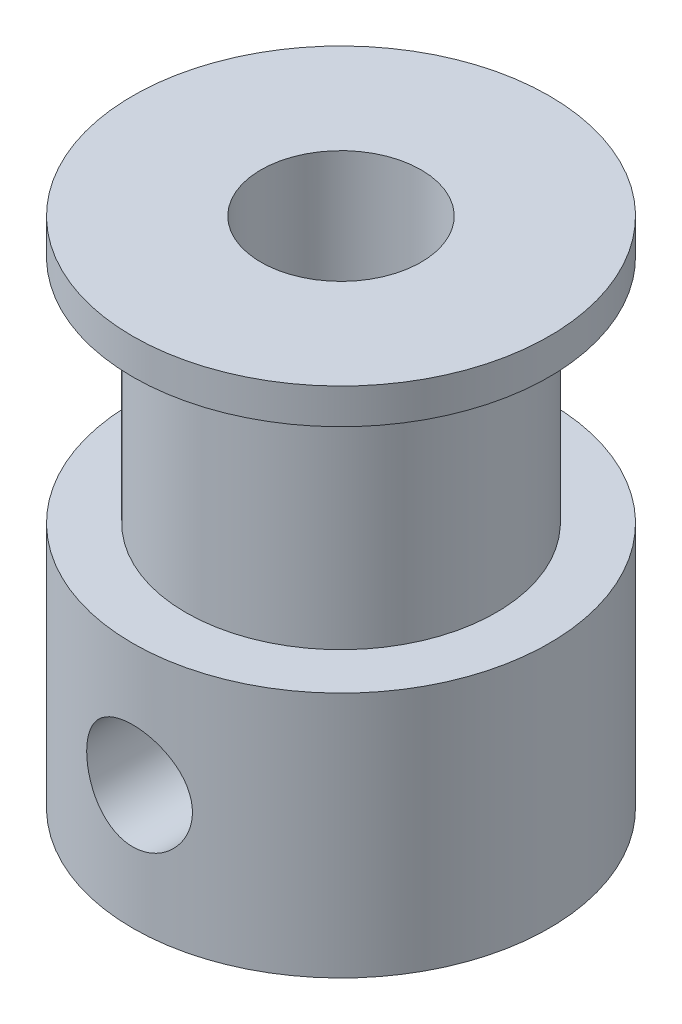
ISO-10303-21;
HEADER;
FILE_DESCRIPTION(('STEP AP214'),'2;1');
FILE_NAME('part.step','',(''),(''),'','','');
FILE_SCHEMA(('AUTOMOTIVE_DESIGN { 1 0 10303 214 1 1 1 1 }'));
ENDSEC;
DATA;
#1=APPLICATION_CONTEXT('core data for automotive mechanical design processes');
#2=APPLICATION_PROTOCOL_DEFINITION('international standard','automotive_design',2000,#1);
#3=PRODUCT_CONTEXT('',#1,'mechanical');
#4=PRODUCT('Part','Part','',(#3));
#5=PRODUCT_RELATED_PRODUCT_CATEGORY('part','',(#4));
#6=PRODUCT_DEFINITION_FORMATION('','',#4);
#7=PRODUCT_DEFINITION_CONTEXT('part definition',#1,'design');
#8=PRODUCT_DEFINITION('design','',#6,#7);
#9=PRODUCT_DEFINITION_SHAPE('','',#8);
#10=(LENGTH_UNIT() NAMED_UNIT(*) SI_UNIT(.MILLI.,.METRE.));
#11=(NAMED_UNIT(*) PLANE_ANGLE_UNIT() SI_UNIT($,.RADIAN.));
#12=(NAMED_UNIT(*) SI_UNIT($,.STERADIAN.) SOLID_ANGLE_UNIT());
#13=UNCERTAINTY_MEASURE_WITH_UNIT(LENGTH_MEASURE(1.E-05),#10,'distance_accuracy_value','');
#14=(GEOMETRIC_REPRESENTATION_CONTEXT(3) GLOBAL_UNCERTAINTY_ASSIGNED_CONTEXT((#13)) GLOBAL_UNIT_ASSIGNED_CONTEXT((#10,
#11,#12)) REPRESENTATION_CONTEXT('',''));
#15=CARTESIAN_POINT('',(0.,0.,0.));
#16=DIRECTION('',(0.,0.,1.));
#17=DIRECTION('',(1.,0.,0.));
#18=AXIS2_PLACEMENT_3D('',#15,#16,#17);
#19=CARTESIAN_POINT('',(0.,0.,0.));
#20=DIRECTION('',(0.,-1.,0.));
#21=DIRECTION('',(0.,0.,-1.));
#22=AXIS2_PLACEMENT_3D('',#19,#20,#21);
#23=CYLINDRICAL_SURFACE('',#22,2.5);
#24=CARTESIAN_POINT('',(-1.87816399709929,3.85,-1.65));
#25=CARTESIAN_POINT('',(-1.87817356740866,3.93079427655975,-1.64999443072167));
#26=CARTESIAN_POINT('',(-1.88347418282792,4.01162636905579,-1.64401449371116));
#27=CARTESIAN_POINT('',(-1.90365752241832,4.17041795060532,-1.62058860250623));
#28=CARTESIAN_POINT('',(-1.9185574504896,4.24837201591593,-1.6031220608348));
#29=CARTESIAN_POINT('',(-1.95530612756547,4.39863333158224,-1.55807727538571));
#30=CARTESIAN_POINT('',(-1.97708883218855,4.47098643150526,-1.53059477126485));
#31=CARTESIAN_POINT('',(-2.02503214275444,4.60994524738078,-1.46657517741326));
#32=CARTESIAN_POINT('',(-2.05119370638084,4.67654970122849,-1.43003610611277));
#33=CARTESIAN_POINT('',(-2.10971828562918,4.81321736687682,-1.342483593019));
#34=CARTESIAN_POINT('',(-2.14241946389367,4.88226727651007,-1.29011420470095));
#35=CARTESIAN_POINT('',(-2.20758221587981,5.01147714614391,-1.17514144468482));
#36=CARTESIAN_POINT('',(-2.24004353252862,5.07162860029669,-1.11252840012499));
#37=CARTESIAN_POINT('',(-2.3064419767716,5.18973271619889,-0.968234915676902));
#38=CARTESIAN_POINT('',(-2.33994640603816,5.24619090363769,-0.885111648041926));
#39=CARTESIAN_POINT('',(-2.39949293751456,5.34384115428656,-0.707908997031482));
#40=CARTESIAN_POINT('',(-2.42554320107045,5.38504992824282,-0.613841755901947));
#41=CARTESIAN_POINT('',(-2.46464353514927,5.44607361226672,-0.428365536633292));
#42=CARTESIAN_POINT('',(-2.47881191391302,5.46774914948944,-0.337811072451697));
#43=CARTESIAN_POINT('',(-2.49700266516608,5.49549014711655,-0.15338070492647));
#44=CARTESIAN_POINT('',(-2.50103745363967,5.50157471024375,-0.0595090091735782));
#45=CARTESIAN_POINT('',(-2.49868729659539,5.49800862462096,0.113712663637894));
#46=CARTESIAN_POINT('',(-2.49376656842583,5.49056933208685,0.193140500290931));
#47=CARTESIAN_POINT('',(-2.47671798966374,5.46453692457822,0.3493383081911));
#48=CARTESIAN_POINT('',(-2.46458960851095,5.44594298850181,0.426108083336214));
#49=CARTESIAN_POINT('',(-2.4341916732427,5.39858528412734,0.574862419576148));
#50=CARTESIAN_POINT('',(-2.41593946394568,5.36985022722839,0.646859815580449));
#51=CARTESIAN_POINT('',(-2.37464804586783,5.30331789592823,0.785017034503283));
#52=CARTESIAN_POINT('',(-2.35160793342518,5.2655189106069,0.851175752075154));
#53=CARTESIAN_POINT('',(-2.29902245001357,5.1764481916351,0.985047000791306));
#54=CARTESIAN_POINT('',(-2.26902056419845,5.12406230137878,1.05183695764555));
#55=CARTESIAN_POINT('',(-2.20709218917539,5.01019022775839,1.17625968695307));
#56=CARTESIAN_POINT('',(-2.17516278943165,4.94869006733423,1.23387810796581));
#57=CARTESIAN_POINT('',(-2.10711048312635,4.80750690257426,1.34724934289721));
#58=CARTESIAN_POINT('',(-2.07108428413496,4.72648069757492,1.40139996434747));
#59=CARTESIAN_POINT('',(-2.00437957659369,4.55447022283534,1.49525229324493));
#60=CARTESIAN_POINT('',(-1.973691925336,4.4635034211415,1.53497883258691));
#61=CARTESIAN_POINT('',(-1.93021206234819,4.30004901179962,1.58906609884217));
#62=CARTESIAN_POINT('',(-1.91481376393406,4.22958306194073,1.60742065844977));
#63=CARTESIAN_POINT('',(-1.89156962487726,4.08568483824098,1.63471528383588));
#64=CARTESIAN_POINT('',(-1.88371114115,4.01225774603094,1.64367111218458));
#65=CARTESIAN_POINT('',(-1.8767563549997,3.86413898103529,1.65161100823904));
#66=CARTESIAN_POINT('',(-1.87769482426888,3.78944345582033,1.65055550398267));
#67=CARTESIAN_POINT('',(-1.88825914723377,3.64146670785289,1.63845508785891));
#68=CARTESIAN_POINT('',(-1.89789215655035,3.56818670082214,1.62740194790476));
#69=CARTESIAN_POINT('',(-1.92377320788271,3.42815606994753,1.59670654181038));
#70=CARTESIAN_POINT('',(-1.9397182942886,3.36126015669811,1.57745493961548));
#71=CARTESIAN_POINT('',(-1.97637475195714,3.23158821030647,1.53127715983158));
#72=CARTESIAN_POINT('',(-1.99708770330354,3.16881355184298,1.50434843731629));
#73=CARTESIAN_POINT('',(-2.0459202403853,3.03584653371123,1.43744371796296));
#74=CARTESIAN_POINT('',(-2.07469338349939,2.96666627761784,1.39593741519331));
#75=CARTESIAN_POINT('',(-2.13386307226145,2.8354540035836,1.30370192953132));
#76=CARTESIAN_POINT('',(-2.16426156090021,2.77343083426984,1.25296152557761));
#77=CARTESIAN_POINT('',(-2.23066104299161,2.64502279309447,1.13132559349667));
#78=CARTESIAN_POINT('',(-2.26650752858329,2.58042825569478,1.05843368437051));
#79=CARTESIAN_POINT('',(-2.33354741548986,2.46429294484174,0.901029136145241));
#80=CARTESIAN_POINT('',(-2.36474520160667,2.41273983785047,0.816527594120806));
#81=CARTESIAN_POINT('',(-2.41383928477657,2.33346296196824,0.655022436944616));
#82=CARTESIAN_POINT('',(-2.43314294605933,2.30305320616478,0.579766982761496));
#83=CARTESIAN_POINT('',(-2.46500344203446,2.25340770004291,0.424305717798097));
#84=CARTESIAN_POINT('',(-2.47756592552063,2.23416259316717,0.344104114697715));
#85=CARTESIAN_POINT('',(-2.49483359194805,2.20780779187865,0.180532057501472));
#86=CARTESIAN_POINT('',(-2.49950622522129,2.20074836698325,0.0971499203468037));
#87=CARTESIAN_POINT('',(-2.50041880991432,2.19936521725825,-0.069770304688643));
#88=CARTESIAN_POINT('',(-2.49665914509096,2.20504091284883,-0.153308385299499));
#89=CARTESIAN_POINT('',(-2.48162224491364,2.2279594817533,-0.312248842068663));
#90=CARTESIAN_POINT('',(-2.47086791156197,2.24439826797344,-0.387820405838233));
#91=CARTESIAN_POINT('',(-2.44325497490618,2.28722616352495,-0.534890956581197));
#92=CARTESIAN_POINT('',(-2.4263954123254,2.3136168365613,-0.606389301510787));
#93=CARTESIAN_POINT('',(-2.38659098522815,2.37725696718864,-0.748299731069998));
#94=CARTESIAN_POINT('',(-2.36333062488106,2.41508395318077,-0.818362050887257));
#95=CARTESIAN_POINT('',(-2.31298664760704,2.49960758414192,-0.951399734920281));
#96=CARTESIAN_POINT('',(-2.2859005630314,2.54630996063964,-1.0143704774724));
#97=CARTESIAN_POINT('',(-2.2252813274897,2.65552907515257,-1.14186276834818));
#98=CARTESIAN_POINT('',(-2.19140310364951,2.71937720174745,-1.20508031729177));
#99=CARTESIAN_POINT('',(-2.12387294022856,2.85656834044151,-1.32046767601712));
#100=CARTESIAN_POINT('',(-2.09022116132146,2.92991747200143,-1.37263030790415));
#101=CARTESIAN_POINT('',(-2.02963185186414,3.07797320198262,-1.46053735742483));
#102=CARTESIAN_POINT('',(-2.00236030827309,3.15189495776456,-1.49736813204505));
#103=CARTESIAN_POINT('',(-1.95397052678841,3.30610913288328,-1.55999123252305));
#104=CARTESIAN_POINT('',(-1.93283919103843,3.38638751989307,-1.58580711054237));
#105=CARTESIAN_POINT('',(-1.90415675714691,3.53069139681369,-1.62004735146957));
#106=CARTESIAN_POINT('',(-1.89451740482451,3.59364690760694,-1.63122690692698));
#107=CARTESIAN_POINT('',(-1.88151889606351,3.72106080182246,-1.64620346660995));
#108=CARTESIAN_POINT('',(-1.8781563590673,3.78551835732424,-1.65000444482247));
#109=CARTESIAN_POINT('',(-1.87816399709929,3.85,-1.65));
#110=B_SPLINE_CURVE_WITH_KNOTS('',3,(#24,#25,#26,#27,#28,#29,#30,#31,#32,#33,#34,#35,#36,#37,
#38,#39,#40,#41,#42,#43,#44,#45,#46,#47,#48,#49,#50,#51,#52,#53,#54,#55,#56,#57,#58,#59,#60,#61,
#62,#63,#64,#65,#66,#67,#68,#69,#70,#71,#72,#73,#74,#75,#76,#77,#78,#79,#80,#81,#82,#83,#84,#85,
#86,#87,#88,#89,#90,#91,#92,#93,#94,#95,#96,#97,#98,#99,#100,#101,#102,#103,#104,#105,#106,#107,
#108,#109),.UNSPECIFIED.,.T.,.F.,(4,2,2,2,2,2,2,2,2,2,2,2,2,2,2,2,2,2,2,2,2,2,2,2,2,2,2,2,2,2,2,
2,2,2,2,2,2,2,2,2,2,2,4),(0.,0.242089089232209,0.484613262365226,0.72487754222912,
0.965194438206267,1.24204242334406,1.51915335508711,1.83517136959405,2.15084204970881,
2.43163690958526,2.71208756281943,2.9507129324479,3.18935586962918,3.4273285139579,
3.66534611375404,3.93440451568684,4.203879881767,4.51414003592555,4.8238634978649,
5.0462567712386,5.26827647088754,5.49117411610793,5.71425537389903,5.92772322794785,
6.14126192794926,6.39732261532283,6.65369656488884,6.96356575078111,7.27314078239638,
7.5223841368641,7.77141830954323,8.02147738775787,8.27152508592674,8.50474641601318,
8.73800440662636,8.98590102363146,9.2339582740861,9.52089661145363,9.80802068929723,
10.067982581361,10.3273858003361,10.520700440269,10.7139109350251),.UNSPECIFIED.);
#111=CARTESIAN_POINT('',(-1.87816399709929,3.85,-1.65));
#112=VERTEX_POINT('',#111);
#113=EDGE_CURVE('E79',#112,#112,#110,.T.);
#114=ORIENTED_EDGE('',*,*,#113,.F.);
#115=EDGE_LOOP('',(#114));
#116=FACE_BOUND('',#115,.T.);
#117=CARTESIAN_POINT('',(-1.65,3.85,1.8781639970993));
#118=CARTESIAN_POINT('',(-1.64999443072166,3.93079427655975,1.87817356740867));
#119=CARTESIAN_POINT('',(-1.64401449371115,4.01162636905579,1.88347418282792));
#120=CARTESIAN_POINT('',(-1.62058860250622,4.17041795060532,1.90365752241832));
#121=CARTESIAN_POINT('',(-1.60312206083479,4.24837201591593,1.9185574504896));
#122=CARTESIAN_POINT('',(-1.5580772753857,4.39863333158224,1.95530612756548));
#123=CARTESIAN_POINT('',(-1.53059477126484,4.47098643150526,1.97708883218856));
#124=CARTESIAN_POINT('',(-1.46657517741325,4.60994524738078,2.02503214275445));
#125=CARTESIAN_POINT('',(-1.43003610611276,4.67654970122849,2.05119370638085));
#126=CARTESIAN_POINT('',(-1.342483593019,4.81321736687682,2.10971828562919));
#127=CARTESIAN_POINT('',(-1.29011420470095,4.88226727651007,2.14241946389367));
#128=CARTESIAN_POINT('',(-1.17514144468481,5.01147714614391,2.20758221587981));
#129=CARTESIAN_POINT('',(-1.11252840012499,5.07162860029669,2.24004353252863));
#130=CARTESIAN_POINT('',(-0.968234915676894,5.18973271619889,2.3064419767716));
#131=CARTESIAN_POINT('',(-0.885111648041918,5.24619090363769,2.33994640603816));
#132=CARTESIAN_POINT('',(-0.707908997031473,5.34384115428656,2.39949293751456));
#133=CARTESIAN_POINT('',(-0.613841755901938,5.38504992824282,2.42554320107045));
#134=CARTESIAN_POINT('',(-0.428365536633282,5.44607361226672,2.46464353514927));
#135=CARTESIAN_POINT('',(-0.337811072451687,5.46774914948944,2.47881191391302));
#136=CARTESIAN_POINT('',(-0.153380704926459,5.49549014711655,2.49700266516609));
#137=CARTESIAN_POINT('',(-0.0595090091735679,5.50157471024376,2.50103745363967));
#138=CARTESIAN_POINT('',(0.113712663637905,5.49800862462096,2.49868729659539));
#139=CARTESIAN_POINT('',(0.193140500290941,5.49056933208685,2.49376656842582));
#140=CARTESIAN_POINT('',(0.34933830819111,5.46453692457822,2.47671798966374));
#141=CARTESIAN_POINT('',(0.426108083336224,5.44594298850181,2.46458960851095));
#142=CARTESIAN_POINT('',(0.574862419576158,5.39858528412734,2.4341916732427));
#143=CARTESIAN_POINT('',(0.646859815580458,5.36985022722839,2.41593946394568));
#144=CARTESIAN_POINT('',(0.785017034503292,5.30331789592823,2.37464804586783));
#145=CARTESIAN_POINT('',(0.851175752075163,5.2655189106069,2.35160793342517));
#146=CARTESIAN_POINT('',(0.985047000791315,5.1764481916351,2.29902245001356));
#147=CARTESIAN_POINT('',(1.05183695764556,5.12406230137878,2.26902056419845));
#148=CARTESIAN_POINT('',(1.17625968695308,5.01019022775839,2.20709218917539));
#149=CARTESIAN_POINT('',(1.23387810796581,4.94869006733423,2.17516278943164));
#150=CARTESIAN_POINT('',(1.34724934289722,4.80750690257425,2.10711048312634));
#151=CARTESIAN_POINT('',(1.40139996434747,4.72648069757492,2.07108428413495));
#152=CARTESIAN_POINT('',(1.49525229324493,4.55447022283534,2.00437957659369));
#153=CARTESIAN_POINT('',(1.53497883258692,4.4635034211415,1.97369192533599));
#154=CARTESIAN_POINT('',(1.58906609884217,4.30004901179961,1.93021206234818));
#155=CARTESIAN_POINT('',(1.60742065844978,4.22958306194073,1.91481376393406));
#156=CARTESIAN_POINT('',(1.63471528383589,4.08568483824098,1.89156962487725));
#157=CARTESIAN_POINT('',(1.64367111218458,4.01225774603094,1.88371114114999));
#158=CARTESIAN_POINT('',(1.65161100823905,3.86413898103529,1.87675635499969));
#159=CARTESIAN_POINT('',(1.65055550398267,3.78944345582033,1.87769482426887));
#160=CARTESIAN_POINT('',(1.63845508785892,3.64146670785288,1.88825914723376));
#161=CARTESIAN_POINT('',(1.62740194790477,3.56818670082213,1.89789215655035));
#162=CARTESIAN_POINT('',(1.59670654181038,3.42815606994753,1.9237732078827));
#163=CARTESIAN_POINT('',(1.57745493961549,3.3612601566981,1.93971829428859));
#164=CARTESIAN_POINT('',(1.53127715983159,3.23158821030647,1.97637475195714));
#165=CARTESIAN_POINT('',(1.5043484373163,3.16881355184297,1.99708770330353));
#166=CARTESIAN_POINT('',(1.43744371796297,3.03584653371123,2.0459202403853));
#167=CARTESIAN_POINT('',(1.39593741519331,2.96666627761783,2.07469338349939));
#168=CARTESIAN_POINT('',(1.30370192953133,2.8354540035836,2.13386307226144));
#169=CARTESIAN_POINT('',(1.25296152557762,2.77343083426984,2.16426156090021));
#170=CARTESIAN_POINT('',(1.13132559349667,2.64502279309447,2.23066104299161));
#171=CARTESIAN_POINT('',(1.05843368437051,2.58042825569478,2.26650752858329));
#172=CARTESIAN_POINT('',(0.901029136145248,2.46429294484174,2.33354741548986));
#173=CARTESIAN_POINT('',(0.816527594120813,2.41273983785047,2.36474520160667));
#174=CARTESIAN_POINT('',(0.655022436944623,2.33346296196824,2.41383928477657));
#175=CARTESIAN_POINT('',(0.579766982761502,2.30305320616478,2.43314294605933));
#176=CARTESIAN_POINT('',(0.424305717798104,2.25340770004291,2.46500344203446));
#177=CARTESIAN_POINT('',(0.344104114697721,2.23416259316717,2.47756592552063));
#178=CARTESIAN_POINT('',(0.180532057501479,2.20780779187865,2.49483359194805));
#179=CARTESIAN_POINT('',(0.0971499203468112,2.20074836698325,2.49950622522129));
#180=CARTESIAN_POINT('',(-0.0697703046886355,2.19936521725824,2.50041880991432));
#181=CARTESIAN_POINT('',(-0.153308385299493,2.20504091284883,2.49665914509096));
#182=CARTESIAN_POINT('',(-0.312248842068657,2.2279594817533,2.48162224491364));
#183=CARTESIAN_POINT('',(-0.387820405838227,2.24439826797344,2.47086791156197));
#184=CARTESIAN_POINT('',(-0.534890956581191,2.28722616352495,2.44325497490618));
#185=CARTESIAN_POINT('',(-0.606389301510781,2.31361683656131,2.42639541232541));
#186=CARTESIAN_POINT('',(-0.748299731069992,2.37725696718864,2.38659098522815));
#187=CARTESIAN_POINT('',(-0.81836205088725,2.41508395318078,2.36333062488106));
#188=CARTESIAN_POINT('',(-0.951399734920275,2.49960758414192,2.31298664760704));
#189=CARTESIAN_POINT('',(-1.01437047747239,2.54630996063964,2.2859005630314));
#190=CARTESIAN_POINT('',(-1.14186276834818,2.65552907515257,2.2252813274897));
#191=CARTESIAN_POINT('',(-1.20508031729176,2.71937720174745,2.19140310364951));
#192=CARTESIAN_POINT('',(-1.32046767601712,2.85656834044152,2.12387294022856));
#193=CARTESIAN_POINT('',(-1.37263030790415,2.92991747200144,2.09022116132146));
#194=CARTESIAN_POINT('',(-1.46053735742482,3.07797320198262,2.02963185186414));
#195=CARTESIAN_POINT('',(-1.49736813204505,3.15189495776456,2.00236030827309));
#196=CARTESIAN_POINT('',(-1.55999123252305,3.30610913288328,1.95397052678842));
#197=CARTESIAN_POINT('',(-1.58580711054236,3.38638751989308,1.93283919103843));
#198=CARTESIAN_POINT('',(-1.62004735146957,3.53069139681369,1.90415675714692));
#199=CARTESIAN_POINT('',(-1.63122690692697,3.59364690760694,1.89451740482451));
#200=CARTESIAN_POINT('',(-1.64620346660994,3.72106080182247,1.88151889606352));
#201=CARTESIAN_POINT('',(-1.65000444482246,3.78551835732424,1.87815635906731));
#202=CARTESIAN_POINT('',(-1.65,3.85,1.8781639970993));
#203=B_SPLINE_CURVE_WITH_KNOTS('',3,(#117,#118,#119,#120,#121,#122,#123,#124,#125,#126,#127,
#128,#129,#130,#131,#132,#133,#134,#135,#136,#137,#138,#139,#140,#141,#142,#143,#144,#145,#146,
#147,#148,#149,#150,#151,#152,#153,#154,#155,#156,#157,#158,#159,#160,#161,#162,#163,#164,#165,
#166,#167,#168,#169,#170,#171,#172,#173,#174,#175,#176,#177,#178,#179,#180,#181,#182,#183,#184,
#185,#186,#187,#188,#189,#190,#191,#192,#193,#194,#195,#196,#197,#198,#199,#200,#201,#202),
.UNSPECIFIED.,.T.,.F.,(4,2,2,2,2,2,2,2,2,2,2,2,2,2,2,2,2,2,2,2,2,2,2,2,2,2,2,2,2,2,2,2,2,2,2,2,
2,2,2,2,2,2,4),(0.,0.24208908923221,0.484613262365226,0.72487754222912,0.965194438206267,
1.24204242334406,1.51915335508711,1.83517136959405,2.15084204970881,2.43163690958527,
2.71208756281943,2.9507129324479,3.18935586962918,3.4273285139579,3.66534611375404,
3.93440451568685,4.203879881767,4.51414003592555,4.82386349786491,5.0462567712386,
5.26827647088755,5.49117411610793,5.71425537389903,5.92772322794786,6.14126192794926,
6.39732261532283,6.65369656488884,6.96356575078112,7.27314078239638,7.52238413686411,
7.77141830954323,8.02147738775787,8.27152508592675,8.50474641601319,8.73800440662636,
8.98590102363146,9.23395827408611,9.52089661145364,9.80802068929723,10.067982581361,
10.3273858003361,10.520700440269,10.7139109350251),.UNSPECIFIED.);
#204=CARTESIAN_POINT('',(-1.65,3.85,1.8781639970993));
#205=VERTEX_POINT('',#204);
#206=EDGE_CURVE('E71',#205,#205,#203,.T.);
#207=ORIENTED_EDGE('',*,*,#206,.F.);
#208=EDGE_LOOP('',(#207));
#209=FACE_BOUND('',#208,.T.);
#210=CARTESIAN_POINT('',(0.,0.,0.));
#211=DIRECTION('',(0.,-1.,0.));
#212=DIRECTION('',(0.,0.,-1.));
#213=AXIS2_PLACEMENT_3D('',#210,#211,#212);
#214=CIRCLE('',#213,2.5);
#215=CARTESIAN_POINT('',(0.,0.,-2.5));
#216=VERTEX_POINT('',#215);
#217=EDGE_CURVE('E78',#216,#216,#214,.T.);
#218=ORIENTED_EDGE('',*,*,#217,.T.);
#219=EDGE_LOOP('',(#218));
#220=FACE_BOUND('',#219,.T.);
#221=CARTESIAN_POINT('',(0.,16.,0.));
#222=DIRECTION('',(0.,-1.,0.));
#223=DIRECTION('',(0.,0.,-1.));
#224=AXIS2_PLACEMENT_3D('',#221,#222,#223);
#225=CIRCLE('',#224,2.5);
#226=CARTESIAN_POINT('',(0.,16.,-2.5));
#227=VERTEX_POINT('',#226);
#228=EDGE_CURVE('E47',#227,#227,#225,.T.);
#229=ORIENTED_EDGE('',*,*,#228,.F.);
#230=EDGE_LOOP('',(#229));
#231=FACE_BOUND('',#230,.T.);
#232=ADVANCED_FACE('F31',(#116,#209,#220,#231),#23,.F.);
#233=CARTESIAN_POINT('',(2.5,16.,0.));
#234=DIRECTION('',(0.,1.,0.));
#235=DIRECTION('',(0.,0.,1.));
#236=AXIS2_PLACEMENT_3D('',#233,#234,#235);
#237=PLANE('',#236);
#238=ORIENTED_EDGE('',*,*,#228,.T.);
#239=EDGE_LOOP('',(#238));
#240=FACE_BOUND('',#239,.T.);
#241=CARTESIAN_POINT('',(0.,16.,0.));
#242=DIRECTION('',(0.,-1.,0.));
#243=DIRECTION('',(0.,0.,-1.));
#244=AXIS2_PLACEMENT_3D('',#241,#242,#243);
#245=CIRCLE('',#244,6.5);
#246=CARTESIAN_POINT('',(0.,16.,-6.5));
#247=VERTEX_POINT('',#246);
#248=EDGE_CURVE('E51',#247,#247,#245,.T.);
#249=ORIENTED_EDGE('',*,*,#248,.F.);
#250=EDGE_LOOP('',(#249));
#251=FACE_BOUND('',#250,.T.);
#252=ADVANCED_FACE('F105',(#240,#251),#237,.T.);
#253=CARTESIAN_POINT('',(0.,0.,0.));
#254=DIRECTION('',(0.,-1.,0.));
#255=DIRECTION('',(0.,0.,-1.));
#256=AXIS2_PLACEMENT_3D('',#253,#254,#255);
#257=CYLINDRICAL_SURFACE('',#256,6.5);
#258=ORIENTED_EDGE('',*,*,#248,.T.);
#259=EDGE_LOOP('',(#258));
#260=FACE_BOUND('',#259,.T.);
#261=CARTESIAN_POINT('',(0.,14.9,0.));
#262=DIRECTION('',(0.,-1.,0.));
#263=DIRECTION('',(0.,0.,-1.));
#264=AXIS2_PLACEMENT_3D('',#261,#262,#263);
#265=CIRCLE('',#264,6.5);
#266=CARTESIAN_POINT('',(0.,14.9,-6.5));
#267=VERTEX_POINT('',#266);
#268=EDGE_CURVE('E97',#267,#267,#265,.T.);
#269=ORIENTED_EDGE('',*,*,#268,.F.);
#270=EDGE_LOOP('',(#269));
#271=FACE_BOUND('',#270,.T.);
#272=ADVANCED_FACE('F102',(#260,#271),#257,.T.);
#273=CARTESIAN_POINT('',(6.5,14.9,0.));
#274=DIRECTION('',(0.,-1.,0.));
#275=DIRECTION('',(0.,0.,-1.));
#276=AXIS2_PLACEMENT_3D('',#273,#274,#275);
#277=PLANE('',#276);
#278=ORIENTED_EDGE('',*,*,#268,.T.);
#279=EDGE_LOOP('',(#278));
#280=FACE_BOUND('',#279,.T.);
#281=CARTESIAN_POINT('',(0.,14.9,0.));
#282=DIRECTION('',(0.,-1.,0.));
#283=DIRECTION('',(0.,0.,-1.));
#284=AXIS2_PLACEMENT_3D('',#281,#282,#283);
#285=CIRCLE('',#284,4.84);
#286=CARTESIAN_POINT('',(0.,14.9,-4.84));
#287=VERTEX_POINT('',#286);
#288=EDGE_CURVE('E94',#287,#287,#285,.T.);
#289=ORIENTED_EDGE('',*,*,#288,.F.);
#290=EDGE_LOOP('',(#289));
#291=FACE_BOUND('',#290,.T.);
#292=ADVANCED_FACE('F112',(#280,#291),#277,.T.);
#293=CARTESIAN_POINT('',(0.,0.,0.));
#294=DIRECTION('',(0.,-1.,0.));
#295=DIRECTION('',(0.,0.,-1.));
#296=AXIS2_PLACEMENT_3D('',#293,#294,#295);
#297=CYLINDRICAL_SURFACE('',#296,4.84);
#298=ORIENTED_EDGE('',*,*,#288,.T.);
#299=EDGE_LOOP('',(#298));
#300=FACE_BOUND('',#299,.T.);
#301=CARTESIAN_POINT('',(0.,7.7,0.));
#302=DIRECTION('',(0.,-1.,0.));
#303=DIRECTION('',(0.,0.,-1.));
#304=AXIS2_PLACEMENT_3D('',#301,#302,#303);
#305=CIRCLE('',#304,4.84);
#306=CARTESIAN_POINT('',(0.,7.7,-4.84));
#307=VERTEX_POINT('',#306);
#308=EDGE_CURVE('E91',#307,#307,#305,.T.);
#309=ORIENTED_EDGE('',*,*,#308,.F.);
#310=EDGE_LOOP('',(#309));
#311=FACE_BOUND('',#310,.T.);
#312=ADVANCED_FACE('F119',(#300,#311),#297,.T.);
#313=CARTESIAN_POINT('',(4.84,7.7,0.));
#314=DIRECTION('',(0.,1.,0.));
#315=DIRECTION('',(0.,0.,1.));
#316=AXIS2_PLACEMENT_3D('',#313,#314,#315);
#317=PLANE('',#316);
#318=ORIENTED_EDGE('',*,*,#308,.T.);
#319=EDGE_LOOP('',(#318));
#320=FACE_BOUND('',#319,.T.);
#321=CARTESIAN_POINT('',(0.,7.7,0.));
#322=DIRECTION('',(0.,-1.,0.));
#323=DIRECTION('',(0.,0.,-1.));
#324=AXIS2_PLACEMENT_3D('',#321,#322,#323);
#325=CIRCLE('',#324,6.5);
#326=CARTESIAN_POINT('',(0.,7.7,-6.5));
#327=VERTEX_POINT('',#326);
#328=EDGE_CURVE('E88',#327,#327,#325,.T.);
#329=ORIENTED_EDGE('',*,*,#328,.F.);
#330=EDGE_LOOP('',(#329));
#331=FACE_BOUND('',#330,.T.);
#332=ADVANCED_FACE('F122',(#320,#331),#317,.T.);
#333=CARTESIAN_POINT('',(0.,0.,0.));
#334=DIRECTION('',(0.,-1.,0.));
#335=DIRECTION('',(0.,0.,-1.));
#336=AXIS2_PLACEMENT_3D('',#333,#334,#335);
#337=CYLINDRICAL_SURFACE('',#336,6.5);
#338=CARTESIAN_POINT('',(-6.5,2.2,0.));
#339=CARTESIAN_POINT('',(-6.49999849148034,2.20000247285575,0.0911177503858507));
#340=CARTESIAN_POINT('',(-6.4980650151015,2.20757304897319,0.182262858095365));
#341=CARTESIAN_POINT('',(-6.49053943796148,2.23760811890585,0.361937820756646));
#342=CARTESIAN_POINT('',(-6.48494533438108,2.2600807661009,0.450466216312011));
#343=CARTESIAN_POINT('',(-6.47071750795578,2.31915014656375,0.622287397419851));
#344=CARTESIAN_POINT('',(-6.46208749750639,2.3557296348101,0.705586431636917));
#345=CARTESIAN_POINT('',(-6.44270535969818,2.44191292915929,0.864866150834546));
#346=CARTESIAN_POINT('',(-6.43195314475065,2.49151727285853,0.94084653356333));
#347=CARTESIAN_POINT('',(-6.40923777941343,2.60345198848881,1.08494165624617));
#348=CARTESIAN_POINT('',(-6.39725548483155,2.66600649061807,1.15287927915144));
#349=CARTESIAN_POINT('',(-6.37355665387332,2.8015861365439,1.27742056284568));
#350=CARTESIAN_POINT('',(-6.36184014855969,2.87461249695651,1.33402290487281));
#351=CARTESIAN_POINT('',(-6.33980584668287,3.03044682934448,1.43512676812556));
#352=CARTESIAN_POINT('',(-6.32951232072088,3.1133879127794,1.4794288921584));
#353=CARTESIAN_POINT('',(-6.31176915976444,3.28584406055679,1.55339199639587));
#354=CARTESIAN_POINT('',(-6.3043190546097,3.37535803514894,1.5830553973546));
#355=CARTESIAN_POINT('',(-6.29330322679465,3.55646821609751,1.62629233475192));
#356=CARTESIAN_POINT('',(-6.28966059809193,3.64798346280861,1.64018493928541));
#357=CARTESIAN_POINT('',(-6.28644204901194,3.83211258740486,1.65247997744375));
#358=CARTESIAN_POINT('',(-6.28686544513413,3.92472627802694,1.65088501453493));
#359=CARTESIAN_POINT('',(-6.29166204403964,4.10596788097999,1.6325044780123));
#360=CARTESIAN_POINT('',(-6.29593604050052,4.19463752206693,1.61610042228526));
#361=CARTESIAN_POINT('',(-6.30779399869365,4.36792313379703,1.56917650684073));
#362=CARTESIAN_POINT('',(-6.31537820273063,4.4525388071895,1.5386556137715));
#363=CARTESIAN_POINT('',(-6.33309221869859,4.61633112712799,1.46404250493561));
#364=CARTESIAN_POINT('',(-6.34324760249032,4.69544230331801,1.4198128936181));
#365=CARTESIAN_POINT('',(-6.36494544226101,4.84525605971865,1.31913389984379));
#366=CARTESIAN_POINT('',(-6.37648814769665,4.91595712313131,1.2626823182668));
#367=CARTESIAN_POINT('',(-6.40007669661783,5.04912858601655,1.13719136135144));
#368=CARTESIAN_POINT('',(-6.41212734929307,5.11129546919061,1.06783038255623));
#369=CARTESIAN_POINT('',(-6.43506800190513,5.22317381151127,0.919522532515208));
#370=CARTESIAN_POINT('',(-6.4459579641844,5.27288486661049,0.840575350431417));
#371=CARTESIAN_POINT('',(-6.46540720190951,5.35855684768933,0.674894732770314));
#372=CARTESIAN_POINT('',(-6.47395787369382,5.39446720699559,0.588134074053303));
#373=CARTESIAN_POINT('',(-6.48770263023884,5.45110794148837,0.409541718403744));
#374=CARTESIAN_POINT('',(-6.49289737755419,5.47184131315022,0.317711026327952));
#375=CARTESIAN_POINT('',(-6.49924644511166,5.49707306391333,0.134179279177296));
#376=CARTESIAN_POINT('',(-6.50050356831981,5.50198461647813,0.0425384989604633));
#377=CARTESIAN_POINT('',(-6.4991291685556,5.49656829253506,-0.140255983189007));
#378=CARTESIAN_POINT('',(-6.49649800722503,5.48624183328514,-0.231409729628358));
#379=CARTESIAN_POINT('',(-6.48770867929812,5.45098282689949,-0.409198092309245));
#380=CARTESIAN_POINT('',(-6.48160524971031,5.42627682336056,-0.495880588598924));
#381=CARTESIAN_POINT('',(-6.46656022798463,5.3632197757114,-0.663865402904577));
#382=CARTESIAN_POINT('',(-6.45761834418719,5.32486732933984,-0.745167166996479));
#383=CARTESIAN_POINT('',(-6.4376432610754,5.23481312159473,-0.901717887469311));
#384=CARTESIAN_POINT('',(-6.42657501104735,5.1828814403868,-0.97683000396233));
#385=CARTESIAN_POINT('',(-6.40362831883756,5.06743569336851,-1.11741986610507));
#386=CARTESIAN_POINT('',(-6.39174973250325,5.00391956339313,-1.18289589099315));
#387=CARTESIAN_POINT('',(-6.36814923136525,4.86518716816747,-1.30406635448276));
#388=CARTESIAN_POINT('',(-6.35643893296218,4.78971499482311,-1.35947055793746));
#389=CARTESIAN_POINT('',(-6.3348359451771,4.63030187389346,-1.45682878188375));
#390=CARTESIAN_POINT('',(-6.32494317580465,4.54636129925911,-1.49878339435972));
#391=CARTESIAN_POINT('',(-6.30820564851896,4.37283910006641,-1.56773755394615));
#392=CARTESIAN_POINT('',(-6.30134291296739,4.283294447436,-1.59482554658988));
#393=CARTESIAN_POINT('',(-6.29142787777632,4.10072028573757,-1.63350588726025));
#394=CARTESIAN_POINT('',(-6.28837471379837,4.00769157208972,-1.64510175027644));
#395=CARTESIAN_POINT('',(-6.28649183842141,3.82374742178687,-1.65228074681228));
#396=CARTESIAN_POINT('',(-6.28753962152451,3.73285108000023,-1.64832832798561));
#397=CARTESIAN_POINT('',(-6.29345653429824,3.55306650917892,-1.62558916594656));
#398=CARTESIAN_POINT('',(-6.29832558250899,3.46417823737875,-1.60680273895833));
#399=CARTESIAN_POINT('',(-6.31126706173436,3.29145593153723,-1.55518610871846));
#400=CARTESIAN_POINT('',(-6.31931901702727,3.20759346196213,-1.52244556936803));
#401=CARTESIAN_POINT('',(-6.3377213707967,3.04649112759012,-1.44392066335699));
#402=CARTESIAN_POINT('',(-6.34807209772023,2.96925221135041,-1.39813443247153));
#403=CARTESIAN_POINT('',(-6.37025290066772,2.82135130575576,-1.2933727328439));
#404=CARTESIAN_POINT('',(-6.38211523105463,2.75092154268547,-1.23407618889248));
#405=CARTESIAN_POINT('',(-6.4057929868725,2.62086098579742,-1.10459937775602));
#406=CARTESIAN_POINT('',(-6.41760840043669,2.56123277260884,-1.03441651710486));
#407=CARTESIAN_POINT('',(-6.44012670826218,2.45337091634323,-0.883564094524548));
#408=CARTESIAN_POINT('',(-6.45080446058256,2.40537300882332,-0.802721933411511));
#409=CARTESIAN_POINT('',(-6.46957701766543,2.32372518864203,-0.633851244249688));
#410=CARTESIAN_POINT('',(-6.47767362922087,2.29006523387164,-0.545827797531988));
#411=CARTESIAN_POINT('',(-6.48920819390174,2.24290963261932,-0.381665270886337));
#412=CARTESIAN_POINT('',(-6.49322694643271,2.22685387482,-0.306292143202513));
#413=CARTESIAN_POINT('',(-6.49862338093772,2.20539844081583,-0.153952434713951));
#414=CARTESIAN_POINT('',(-6.50000127455811,2.19999791066804,-0.0769859821028224));
#415=CARTESIAN_POINT('',(-6.5,2.2,0.));
#416=B_SPLINE_CURVE_WITH_KNOTS('',3,(#338,#339,#340,#341,#342,#343,#344,#345,#346,#347,#348,
#349,#350,#351,#352,#353,#354,#355,#356,#357,#358,#359,#360,#361,#362,#363,#364,#365,#366,#367,
#368,#369,#370,#371,#372,#373,#374,#375,#376,#377,#378,#379,#380,#381,#382,#383,#384,#385,#386,
#387,#388,#389,#390,#391,#392,#393,#394,#395,#396,#397,#398,#399,#400,#401,#402,#403,#404,#405,
#406,#407,#408,#409,#410,#411,#412,#413,#414,#415),.UNSPECIFIED.,.T.,.F.,(4,2,2,2,2,2,2,2,2,2,2,
2,2,2,2,2,2,2,2,2,2,2,2,2,2,2,2,2,2,2,2,2,2,2,2,2,2,2,4),(0.,0.273071080673043,
0.546291690312234,0.819179352572715,1.09207827994795,1.37016840025652,1.64829085517239,
1.93068877591832,2.21303998185289,2.4895708626224,2.76605525924413,3.03561386213349,
3.30519219982156,3.57756487843311,3.84998660632108,4.13042684673475,4.41087618300894,
4.69234352388223,4.97375527812578,5.24775597584742,5.52173119090108,5.79150259377981,
6.06130172544544,6.33600366696578,6.61075460391993,6.89247457814755,7.17418215075424,
7.45419508187939,7.73414447043178,8.00579583650455,8.27744141180218,8.54736720344427,
8.81733158675165,9.09454331866246,9.37182119292244,9.65432089037339,9.9366224022095,
10.167360433645,10.398079972269),.UNSPECIFIED.);
#417=CARTESIAN_POINT('',(-6.5,2.2,0.));
#418=VERTEX_POINT('',#417);
#419=EDGE_CURVE('E10',#418,#418,#416,.T.);
#420=ORIENTED_EDGE('',*,*,#419,.F.);
#421=EDGE_LOOP('',(#420));
#422=FACE_BOUND('',#421,.T.);
#423=CARTESIAN_POINT('',(0.,2.2,6.5));
#424=CARTESIAN_POINT('',(0.0911177503858734,2.20000247285575,6.49999849148034));
#425=CARTESIAN_POINT('',(0.182262858095387,2.20757304897319,6.4980650151015));
#426=CARTESIAN_POINT('',(0.361937820756669,2.23760811890585,6.49053943796148));
#427=CARTESIAN_POINT('',(0.450466216312034,2.2600807661009,6.48494533438108));
#428=CARTESIAN_POINT('',(0.622287397419874,2.31915014656375,6.47071750795578));
#429=CARTESIAN_POINT('',(0.70558643163694,2.3557296348101,6.46208749750639));
#430=CARTESIAN_POINT('',(0.864866150834569,2.44191292915929,6.44270535969817));
#431=CARTESIAN_POINT('',(0.940846533563353,2.49151727285853,6.43195314475064));
#432=CARTESIAN_POINT('',(1.08494165624619,2.60345198848881,6.40923777941342));
#433=CARTESIAN_POINT('',(1.15287927915147,2.66600649061807,6.39725548483155));
#434=CARTESIAN_POINT('',(1.27742056284571,2.8015861365439,6.37355665387332));
#435=CARTESIAN_POINT('',(1.33402290487283,2.87461249695651,6.36184014855969));
#436=CARTESIAN_POINT('',(1.43512676812558,3.03044682934448,6.33980584668286));
#437=CARTESIAN_POINT('',(1.47942889215842,3.1133879127794,6.32951232072088));
#438=CARTESIAN_POINT('',(1.5533919963959,3.28584406055679,6.31176915976443));
#439=CARTESIAN_POINT('',(1.58305539735462,3.37535803514894,6.3043190546097));
#440=CARTESIAN_POINT('',(1.62629233475194,3.55646821609751,6.29330322679465));
#441=CARTESIAN_POINT('',(1.64018493928544,3.64798346280861,6.28966059809192));
#442=CARTESIAN_POINT('',(1.65247997744378,3.83211258740486,6.28644204901193));
#443=CARTESIAN_POINT('',(1.65088501453495,3.92472627802694,6.28686544513413));
#444=CARTESIAN_POINT('',(1.63250447801232,4.10596788097999,6.29166204403964));
#445=CARTESIAN_POINT('',(1.61610042228529,4.19463752206693,6.29593604050051));
#446=CARTESIAN_POINT('',(1.56917650684075,4.36792313379703,6.30779399869364));
#447=CARTESIAN_POINT('',(1.53865561377153,4.4525388071895,6.31537820273062));
#448=CARTESIAN_POINT('',(1.46404250493564,4.61633112712799,6.33309221869858));
#449=CARTESIAN_POINT('',(1.41981289361812,4.69544230331801,6.34324760249032));
#450=CARTESIAN_POINT('',(1.31913389984381,4.84525605971865,6.364945442261));
#451=CARTESIAN_POINT('',(1.26268231826682,4.91595712313131,6.37648814769664));
#452=CARTESIAN_POINT('',(1.13719136135147,5.04912858601655,6.40007669661782));
#453=CARTESIAN_POINT('',(1.06783038255625,5.11129546919061,6.41212734929307));
#454=CARTESIAN_POINT('',(0.919522532515231,5.22317381151127,6.43506800190513));
#455=CARTESIAN_POINT('',(0.84057535043144,5.27288486661049,6.4459579641844));
#456=CARTESIAN_POINT('',(0.674894732770337,5.35855684768933,6.4654072019095));
#457=CARTESIAN_POINT('',(0.588134074053326,5.39446720699559,6.47395787369381));
#458=CARTESIAN_POINT('',(0.409541718403766,5.45110794148837,6.48770263023884));
#459=CARTESIAN_POINT('',(0.317711026327974,5.47184131315022,6.49289737755419));
#460=CARTESIAN_POINT('',(0.134179279177319,5.49707306391333,6.49924644511166));
#461=CARTESIAN_POINT('',(0.0425384989604867,5.50198461647813,6.50050356831981));
#462=CARTESIAN_POINT('',(-0.140255983188983,5.49656829253506,6.4991291685556));
#463=CARTESIAN_POINT('',(-0.231409729628335,5.48624183328514,6.49649800722503));
#464=CARTESIAN_POINT('',(-0.409198092309222,5.45098282689949,6.48770867929812));
#465=CARTESIAN_POINT('',(-0.495880588598902,5.42627682336056,6.48160524971031));
#466=CARTESIAN_POINT('',(-0.663865402904555,5.3632197757114,6.46656022798463));
#467=CARTESIAN_POINT('',(-0.745167166996457,5.32486732933984,6.45761834418719));
#468=CARTESIAN_POINT('',(-0.901717887469288,5.23481312159473,6.43764326107541));
#469=CARTESIAN_POINT('',(-0.976830003962307,5.1828814403868,6.42657501104735));
#470=CARTESIAN_POINT('',(-1.11741986610505,5.06743569336851,6.40362831883756));
#471=CARTESIAN_POINT('',(-1.18289589099313,5.00391956339313,6.39174973250325));
#472=CARTESIAN_POINT('',(-1.30406635448273,4.86518716816747,6.36814923136526));
#473=CARTESIAN_POINT('',(-1.35947055793743,4.78971499482311,6.35643893296219));
#474=CARTESIAN_POINT('',(-1.45682878188373,4.63030187389346,6.33483594517711));
#475=CARTESIAN_POINT('',(-1.49878339435969,4.54636129925911,6.32494317580466));
#476=CARTESIAN_POINT('',(-1.56773755394613,4.37283910006641,6.30820564851897));
#477=CARTESIAN_POINT('',(-1.59482554658986,4.283294447436,6.30134291296739));
#478=CARTESIAN_POINT('',(-1.63350588726023,4.10072028573757,6.29142787777632));
#479=CARTESIAN_POINT('',(-1.64510175027642,4.00769157208972,6.28837471379837));
#480=CARTESIAN_POINT('',(-1.65228074681225,3.82374742178687,6.28649183842141));
#481=CARTESIAN_POINT('',(-1.64832832798559,3.73285108000023,6.28753962152452));
#482=CARTESIAN_POINT('',(-1.62558916594654,3.55306650917892,6.29345653429825));
#483=CARTESIAN_POINT('',(-1.60680273895831,3.46417823737875,6.29832558250899));
#484=CARTESIAN_POINT('',(-1.55518610871844,3.29145593153723,6.31126706173437));
#485=CARTESIAN_POINT('',(-1.52244556936801,3.20759346196213,6.31931901702728));
#486=CARTESIAN_POINT('',(-1.44392066335697,3.04649112759012,6.3377213707967));
#487=CARTESIAN_POINT('',(-1.3981344324715,2.96925221135041,6.34807209772024));
#488=CARTESIAN_POINT('',(-1.29337273284388,2.82135130575576,6.37025290066772));
#489=CARTESIAN_POINT('',(-1.23407618889246,2.75092154268547,6.38211523105464));
#490=CARTESIAN_POINT('',(-1.104599377756,2.62086098579743,6.40579298687251));
#491=CARTESIAN_POINT('',(-1.03441651710484,2.56123277260884,6.41760840043669));
#492=CARTESIAN_POINT('',(-0.883564094524527,2.45337091634323,6.44012670826218));
#493=CARTESIAN_POINT('',(-0.80272193341149,2.40537300882332,6.45080446058256));
#494=CARTESIAN_POINT('',(-0.633851244249667,2.32372518864204,6.46957701766543));
#495=CARTESIAN_POINT('',(-0.545827797531966,2.29006523387164,6.47767362922088));
#496=CARTESIAN_POINT('',(-0.381665270886315,2.24290963261932,6.48920819390174));
#497=CARTESIAN_POINT('',(-0.306292143202491,2.22685387482,6.49322694643271));
#498=CARTESIAN_POINT('',(-0.153952434713929,2.20539844081583,6.49862338093772));
#499=CARTESIAN_POINT('',(-0.0769859821028,2.19999791066804,6.50000127455812));
#500=CARTESIAN_POINT('',(0.,2.2,6.5));
#501=B_SPLINE_CURVE_WITH_KNOTS('',3,(#423,#424,#425,#426,#427,#428,#429,#430,#431,#432,#433,
#434,#435,#436,#437,#438,#439,#440,#441,#442,#443,#444,#445,#446,#447,#448,#449,#450,#451,#452,
#453,#454,#455,#456,#457,#458,#459,#460,#461,#462,#463,#464,#465,#466,#467,#468,#469,#470,#471,
#472,#473,#474,#475,#476,#477,#478,#479,#480,#481,#482,#483,#484,#485,#486,#487,#488,#489,#490,
#491,#492,#493,#494,#495,#496,#497,#498,#499,#500),.UNSPECIFIED.,.T.,.F.,(4,2,2,2,2,2,2,2,2,2,2,
2,2,2,2,2,2,2,2,2,2,2,2,2,2,2,2,2,2,2,2,2,2,2,2,2,2,2,4),(0.,0.273071080673043,
0.546291690312234,0.819179352572716,1.09207827994795,1.37016840025652,1.64829085517239,
1.93068877591832,2.21303998185289,2.4895708626224,2.76605525924413,3.03561386213349,
3.30519219982156,3.57756487843311,3.84998660632108,4.13042684673475,4.41087618300894,
4.69234352388223,4.97375527812578,5.24775597584742,5.52173119090108,5.79150259377981,
6.06130172544544,6.33600366696578,6.61075460391993,6.89247457814755,7.17418215075424,
7.45419508187939,7.73414447043178,8.00579583650455,8.27744141180218,8.54736720344427,
8.81733158675165,9.09454331866246,9.37182119292244,9.65432089037339,9.9366224022095,
10.167360433645,10.398079972269),.UNSPECIFIED.);
#502=CARTESIAN_POINT('',(0.,2.2,6.5));
#503=VERTEX_POINT('',#502);
#504=EDGE_CURVE('E43',#503,#503,#501,.T.);
#505=ORIENTED_EDGE('',*,*,#504,.F.);
#506=EDGE_LOOP('',(#505));
#507=FACE_BOUND('',#506,.T.);
#508=ORIENTED_EDGE('',*,*,#328,.T.);
#509=EDGE_LOOP('',(#508));
#510=FACE_BOUND('',#509,.T.);
#511=CARTESIAN_POINT('',(0.,0.,0.));
#512=DIRECTION('',(0.,-1.,0.));
#513=DIRECTION('',(0.,0.,-1.));
#514=AXIS2_PLACEMENT_3D('',#511,#512,#513);
#515=CIRCLE('',#514,6.5);
#516=CARTESIAN_POINT('',(0.,0.,-6.5));
#517=VERTEX_POINT('',#516);
#518=EDGE_CURVE('E85',#517,#517,#515,.T.);
#519=ORIENTED_EDGE('',*,*,#518,.F.);
#520=EDGE_LOOP('',(#519));
#521=FACE_BOUND('',#520,.T.);
#522=ADVANCED_FACE('F58',(#422,#507,#510,#521),#337,.T.);
#523=CARTESIAN_POINT('',(6.5,0.,0.));
#524=DIRECTION('',(0.,-1.,0.));
#525=DIRECTION('',(0.,0.,-1.));
#526=AXIS2_PLACEMENT_3D('',#523,#524,#525);
#527=PLANE('',#526);
#528=ORIENTED_EDGE('',*,*,#518,.T.);
#529=EDGE_LOOP('',(#528));
#530=FACE_BOUND('',#529,.T.);
#531=ORIENTED_EDGE('',*,*,#217,.F.);
#532=EDGE_LOOP('',(#531));
#533=FACE_BOUND('',#532,.T.);
#534=ADVANCED_FACE('F66',(#530,#533),#527,.T.);
#535=CARTESIAN_POINT('',(0.,3.85,0.));
#536=DIRECTION('',(0.,0.,-1.));
#537=DIRECTION('',(-1.,0.,0.));
#538=AXIS2_PLACEMENT_3D('',#535,#536,#537);
#539=CYLINDRICAL_SURFACE('',#538,1.65);
#540=ORIENTED_EDGE('',*,*,#206,.T.);
#541=EDGE_LOOP('',(#540));
#542=FACE_BOUND('',#541,.T.);
#543=ORIENTED_EDGE('',*,*,#504,.T.);
#544=EDGE_LOOP('',(#543));
#545=FACE_BOUND('',#544,.T.);
#546=ADVANCED_FACE('F62',(#542,#545),#539,.F.);
#547=CARTESIAN_POINT('',(0.,3.85,0.));
#548=DIRECTION('',(1.,0.,0.));
#549=DIRECTION('',(0.,0.,-1.));
#550=AXIS2_PLACEMENT_3D('',#547,#548,#549);
#551=CYLINDRICAL_SURFACE('',#550,1.65);
#552=ORIENTED_EDGE('',*,*,#113,.T.);
#553=EDGE_LOOP('',(#552));
#554=FACE_BOUND('',#553,.T.);
#555=ORIENTED_EDGE('',*,*,#419,.T.);
#556=EDGE_LOOP('',(#555));
#557=FACE_BOUND('',#556,.T.);
#558=ADVANCED_FACE('F65',(#554,#557),#551,.F.);
#559=CLOSED_SHELL('',(#232,#252,#272,#292,#312,#332,#522,#534,#546,#558));
#560=MANIFOLD_SOLID_BREP('B2',#559);
#561=ADVANCED_BREP_SHAPE_REPRESENTATION('',(#18,#560),#14);
#562=SHAPE_DEFINITION_REPRESENTATION(#9,#561);
ENDSEC;
END-ISO-10303-21;
